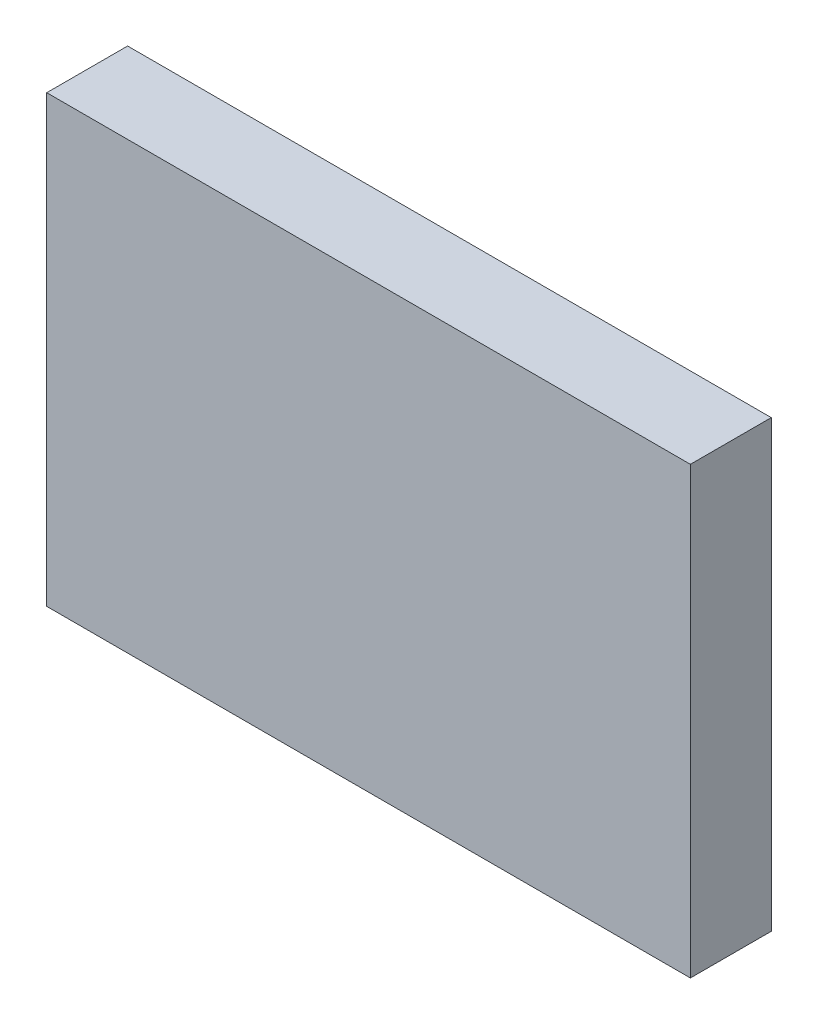
ISO-10303-21;
HEADER;
FILE_DESCRIPTION(('STEP AP214'),'2;1');
FILE_NAME('part.step','',(''),(''),'','','');
FILE_SCHEMA(('AUTOMOTIVE_DESIGN { 1 0 10303 214 1 1 1 1 }'));
ENDSEC;
DATA;
#1=APPLICATION_CONTEXT('core data for automotive mechanical design processes');
#2=APPLICATION_PROTOCOL_DEFINITION('international standard','automotive_design',2000,#1);
#3=PRODUCT_CONTEXT('',#1,'mechanical');
#4=PRODUCT('Part','Part','',(#3));
#5=PRODUCT_RELATED_PRODUCT_CATEGORY('part','',(#4));
#6=PRODUCT_DEFINITION_FORMATION('','',#4);
#7=PRODUCT_DEFINITION_CONTEXT('part definition',#1,'design');
#8=PRODUCT_DEFINITION('design','',#6,#7);
#9=PRODUCT_DEFINITION_SHAPE('','',#8);
#10=(LENGTH_UNIT() NAMED_UNIT(*) SI_UNIT(.MILLI.,.METRE.));
#11=(NAMED_UNIT(*) PLANE_ANGLE_UNIT() SI_UNIT($,.RADIAN.));
#12=(NAMED_UNIT(*) SI_UNIT($,.STERADIAN.) SOLID_ANGLE_UNIT());
#13=UNCERTAINTY_MEASURE_WITH_UNIT(LENGTH_MEASURE(1.E-05),#10,'distance_accuracy_value','');
#14=(GEOMETRIC_REPRESENTATION_CONTEXT(3) GLOBAL_UNCERTAINTY_ASSIGNED_CONTEXT((#13)) GLOBAL_UNIT_ASSIGNED_CONTEXT((#10,
#11,#12)) REPRESENTATION_CONTEXT('',''));
#15=CARTESIAN_POINT('',(0.,0.,0.));
#16=DIRECTION('',(0.,0.,1.));
#17=DIRECTION('',(1.,0.,0.));
#18=AXIS2_PLACEMENT_3D('',#15,#16,#17);
#19=CARTESIAN_POINT('',(-5.96866218,-4.1254045,1.49999954));
#20=DIRECTION('',(0.,0.,-1.));
#21=DIRECTION('',(0.,-1.,0.));
#22=AXIS2_PLACEMENT_3D('',#19,#20,#21);
#23=PLANE('',#22);
#24=DIRECTION('',(0.999999999998166,1.91500199750432E-06,0.));
#25=VECTOR('',#24,1.);
#26=CARTESIAN_POINT('',(-5.96866218,-4.1254045,1.49999954));
#27=LINE('',#26,#25);
#28=CARTESIAN_POINT('',(-5.96866218,-4.1254045,1.49999954));
#29=VERTEX_POINT('',#28);
#30=CARTESIAN_POINT('',(5.96866218,-4.12538164,1.49999954));
#31=VERTEX_POINT('',#30);
#32=EDGE_CURVE('E80',#29,#31,#27,.T.);
#33=ORIENTED_EDGE('',*,*,#32,.T.);
#34=DIRECTION('',(3.07849357862586E-07,0.999999999999953,0.));
#35=VECTOR('',#34,1.);
#36=CARTESIAN_POINT('',(5.96866218,-4.12538164,1.49999954));
#37=LINE('',#36,#35);
#38=CARTESIAN_POINT('',(5.96866472,4.12540704,1.49999954));
#39=VERTEX_POINT('',#38);
#40=EDGE_CURVE('E108',#31,#39,#37,.T.);
#41=ORIENTED_EDGE('',*,*,#40,.T.);
#42=DIRECTION('',(-1.,0.,0.));
#43=VECTOR('',#42,1.);
#44=CARTESIAN_POINT('',(5.96866472,4.12540704,1.49999954));
#45=LINE('',#44,#43);
#46=CARTESIAN_POINT('',(-5.96865964,4.12540704,1.49999954));
#47=VERTEX_POINT('',#46);
#48=EDGE_CURVE('E66',#39,#47,#45,.T.);
#49=ORIENTED_EDGE('',*,*,#48,.T.);
#50=DIRECTION('',(-3.07848504923886E-07,-0.999999999999953,0.));
#51=VECTOR('',#50,1.);
#52=CARTESIAN_POINT('',(-5.96865964,4.12540704,1.49999954));
#53=LINE('',#52,#51);
#54=EDGE_CURVE('E11',#47,#29,#53,.T.);
#55=ORIENTED_EDGE('',*,*,#54,.T.);
#56=EDGE_LOOP('',(#33,#41,#49,#55));
#57=FACE_BOUND('',#56,.T.);
#58=ADVANCED_FACE('F17',(#57),#23,.F.);
#59=CARTESIAN_POINT('',(-5.96866218,-4.1254045,0.));
#60=DIRECTION('',(0.,0.,-1.));
#61=DIRECTION('',(0.,-1.,0.));
#62=AXIS2_PLACEMENT_3D('',#59,#60,#61);
#63=PLANE('',#62);
#64=DIRECTION('',(-3.07848504923886E-07,-0.999999999999953,0.));
#65=VECTOR('',#64,1.);
#66=CARTESIAN_POINT('',(-5.96865964,4.12540704,0.));
#67=LINE('',#66,#65);
#68=CARTESIAN_POINT('',(-5.96865964,4.12540704,0.));
#69=VERTEX_POINT('',#68);
#70=CARTESIAN_POINT('',(-5.96866218,-4.1254045,0.));
#71=VERTEX_POINT('',#70);
#72=EDGE_CURVE('E28',#69,#71,#67,.T.);
#73=ORIENTED_EDGE('',*,*,#72,.F.);
#74=DIRECTION('',(-1.,0.,0.));
#75=VECTOR('',#74,1.);
#76=CARTESIAN_POINT('',(5.96866472,4.12540704,0.));
#77=LINE('',#76,#75);
#78=CARTESIAN_POINT('',(5.96866472,4.12540704,0.));
#79=VERTEX_POINT('',#78);
#80=EDGE_CURVE('E74',#79,#69,#77,.T.);
#81=ORIENTED_EDGE('',*,*,#80,.F.);
#82=DIRECTION('',(3.07849357862586E-07,0.999999999999953,0.));
#83=VECTOR('',#82,1.);
#84=CARTESIAN_POINT('',(5.96866218,-4.12538164,0.));
#85=LINE('',#84,#83);
#86=CARTESIAN_POINT('',(5.96866218,-4.12538164,0.));
#87=VERTEX_POINT('',#86);
#88=EDGE_CURVE('E89',#87,#79,#85,.T.);
#89=ORIENTED_EDGE('',*,*,#88,.F.);
#90=DIRECTION('',(0.999999999998166,1.91500199750432E-06,0.));
#91=VECTOR('',#90,1.);
#92=CARTESIAN_POINT('',(-5.96866218,-4.1254045,0.));
#93=LINE('',#92,#91);
#94=EDGE_CURVE('E99',#71,#87,#93,.T.);
#95=ORIENTED_EDGE('',*,*,#94,.F.);
#96=EDGE_LOOP('',(#73,#81,#89,#95));
#97=FACE_BOUND('',#96,.T.);
#98=ADVANCED_FACE('F129',(#97),#63,.T.);
#99=CARTESIAN_POINT('',(-5.96865964,4.12540704,0.));
#100=DIRECTION('',(0.999999999999952,-3.07848504923886E-07,0.));
#101=DIRECTION('',(0.,0.,-1.));
#102=AXIS2_PLACEMENT_3D('',#99,#100,#101);
#103=PLANE('',#102);
#104=ORIENTED_EDGE('',*,*,#72,.T.);
#105=DIRECTION('',(0.,0.,1.));
#106=VECTOR('',#105,1.);
#107=CARTESIAN_POINT('',(-5.96866218,-4.1254045,0.));
#108=LINE('',#107,#106);
#109=EDGE_CURVE('E21',#71,#29,#108,.T.);
#110=ORIENTED_EDGE('',*,*,#109,.T.);
#111=ORIENTED_EDGE('',*,*,#54,.F.);
#112=DIRECTION('',(0.,0.,1.));
#113=VECTOR('',#112,1.);
#114=CARTESIAN_POINT('',(-5.96865964,4.12540704,0.));
#115=LINE('',#114,#113);
#116=EDGE_CURVE('E103',#69,#47,#115,.T.);
#117=ORIENTED_EDGE('',*,*,#116,.F.);
#118=EDGE_LOOP('',(#104,#110,#111,#117));
#119=FACE_BOUND('',#118,.T.);
#120=ADVANCED_FACE('F84',(#119),#103,.F.);
#121=CARTESIAN_POINT('',(5.96866472,4.12540704,0.));
#122=DIRECTION('',(0.,-1.,0.));
#123=DIRECTION('',(0.,0.,-1.));
#124=AXIS2_PLACEMENT_3D('',#121,#122,#123);
#125=PLANE('',#124);
#126=ORIENTED_EDGE('',*,*,#80,.T.);
#127=ORIENTED_EDGE('',*,*,#116,.T.);
#128=ORIENTED_EDGE('',*,*,#48,.F.);
#129=DIRECTION('',(0.,0.,1.));
#130=VECTOR('',#129,1.);
#131=CARTESIAN_POINT('',(5.96866472,4.12540704,0.));
#132=LINE('',#131,#130);
#133=EDGE_CURVE('E105',#79,#39,#132,.T.);
#134=ORIENTED_EDGE('',*,*,#133,.F.);
#135=EDGE_LOOP('',(#126,#127,#128,#134));
#136=FACE_BOUND('',#135,.T.);
#137=ADVANCED_FACE('F201',(#136),#125,.F.);
#138=CARTESIAN_POINT('',(5.96866218,-4.12538164,0.));
#139=DIRECTION('',(-0.999999999999952,3.07849357862585E-07,0.));
#140=DIRECTION('',(0.,0.,1.));
#141=AXIS2_PLACEMENT_3D('',#138,#139,#140);
#142=PLANE('',#141);
#143=ORIENTED_EDGE('',*,*,#88,.T.);
#144=ORIENTED_EDGE('',*,*,#133,.T.);
#145=ORIENTED_EDGE('',*,*,#40,.F.);
#146=DIRECTION('',(0.,0.,1.));
#147=VECTOR('',#146,1.);
#148=CARTESIAN_POINT('',(5.96866218,-4.12538164,0.));
#149=LINE('',#148,#147);
#150=EDGE_CURVE('E92',#87,#31,#149,.T.);
#151=ORIENTED_EDGE('',*,*,#150,.F.);
#152=EDGE_LOOP('',(#143,#144,#145,#151));
#153=FACE_BOUND('',#152,.T.);
#154=ADVANCED_FACE('F19',(#153),#142,.F.);
#155=CARTESIAN_POINT('',(-5.96866218,-4.1254045,0.));
#156=DIRECTION('',(-1.91500199750432E-06,0.999999999998166,0.));
#157=DIRECTION('',(0.,0.,1.));
#158=AXIS2_PLACEMENT_3D('',#155,#156,#157);
#159=PLANE('',#158);
#160=ORIENTED_EDGE('',*,*,#94,.T.);
#161=ORIENTED_EDGE('',*,*,#150,.T.);
#162=ORIENTED_EDGE('',*,*,#32,.F.);
#163=ORIENTED_EDGE('',*,*,#109,.F.);
#164=EDGE_LOOP('',(#160,#161,#162,#163));
#165=FACE_BOUND('',#164,.T.);
#166=ADVANCED_FACE('F90',(#165),#159,.F.);
#167=CLOSED_SHELL('',(#58,#98,#120,#137,#154,#166));
#168=MANIFOLD_SOLID_BREP('B1',#167);
#169=ADVANCED_BREP_SHAPE_REPRESENTATION('',(#18,#168),#14);
#170=SHAPE_DEFINITION_REPRESENTATION(#9,#169);
ENDSEC;
END-ISO-10303-21;
